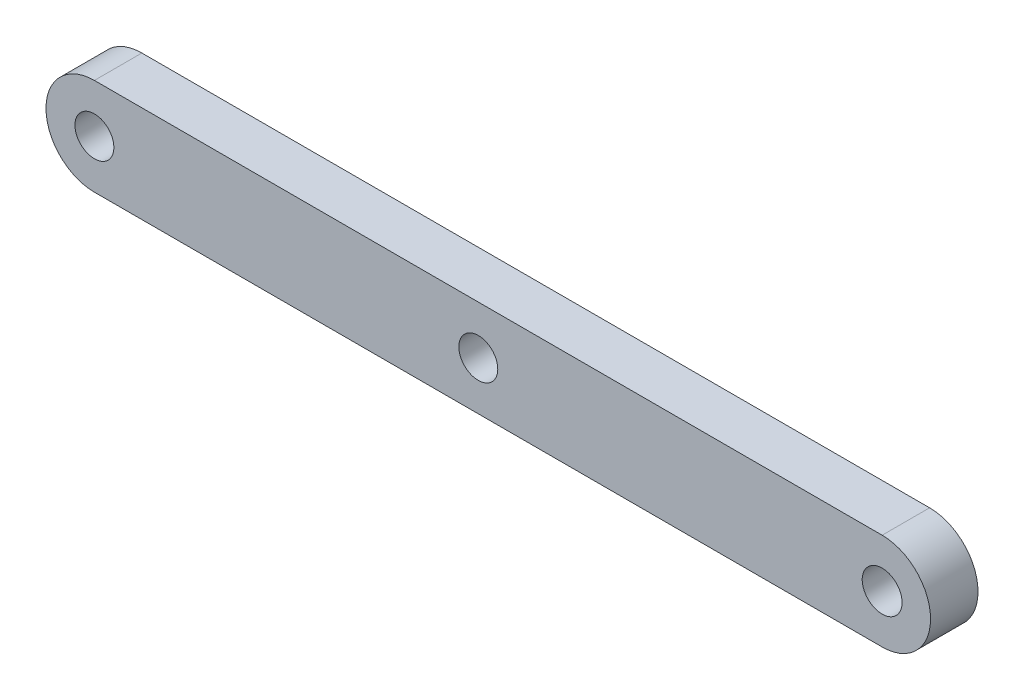
ISO-10303-21;
HEADER;
FILE_DESCRIPTION(('STEP AP214'),'2;1');
FILE_NAME('part.step','',(''),(''),'','','');
FILE_SCHEMA(('AUTOMOTIVE_DESIGN { 1 0 10303 214 1 1 1 1 }'));
ENDSEC;
DATA;
#1=APPLICATION_CONTEXT('core data for automotive mechanical design processes');
#2=APPLICATION_PROTOCOL_DEFINITION('international standard','automotive_design',2000,#1);
#3=PRODUCT_CONTEXT('',#1,'mechanical');
#4=PRODUCT('Part','Part','',(#3));
#5=PRODUCT_RELATED_PRODUCT_CATEGORY('part','',(#4));
#6=PRODUCT_DEFINITION_FORMATION('','',#4);
#7=PRODUCT_DEFINITION_CONTEXT('part definition',#1,'design');
#8=PRODUCT_DEFINITION('design','',#6,#7);
#9=PRODUCT_DEFINITION_SHAPE('','',#8);
#10=(LENGTH_UNIT() NAMED_UNIT(*) SI_UNIT(.MILLI.,.METRE.));
#11=(NAMED_UNIT(*) PLANE_ANGLE_UNIT() SI_UNIT($,.RADIAN.));
#12=(NAMED_UNIT(*) SI_UNIT($,.STERADIAN.) SOLID_ANGLE_UNIT());
#13=UNCERTAINTY_MEASURE_WITH_UNIT(LENGTH_MEASURE(1.E-05),#10,'distance_accuracy_value','');
#14=(GEOMETRIC_REPRESENTATION_CONTEXT(3) GLOBAL_UNCERTAINTY_ASSIGNED_CONTEXT((#13)) GLOBAL_UNIT_ASSIGNED_CONTEXT((#10,
#11,#12)) REPRESENTATION_CONTEXT('',''));
#15=CARTESIAN_POINT('',(0.,0.,0.));
#16=DIRECTION('',(0.,0.,1.));
#17=DIRECTION('',(1.,0.,0.));
#18=AXIS2_PLACEMENT_3D('',#15,#16,#17);
#19=CARTESIAN_POINT('',(0.,0.,5.));
#20=DIRECTION('',(0.,0.,1.));
#21=DIRECTION('',(1.,0.,0.));
#22=AXIS2_PLACEMENT_3D('',#19,#20,#21);
#23=PLANE('',#22);
#24=CARTESIAN_POINT('',(-42.55,0.,5.));
#25=DIRECTION('',(0.,0.,1.));
#26=DIRECTION('',(1.,0.,0.));
#27=AXIS2_PLACEMENT_3D('',#24,#25,#26);
#28=CIRCLE('',#27,2.05);
#29=CARTESIAN_POINT('',(-40.5,0.,5.));
#30=VERTEX_POINT('',#29);
#31=EDGE_CURVE('E116',#30,#30,#28,.T.);
#32=ORIENTED_EDGE('',*,*,#31,.F.);
#33=EDGE_LOOP('',(#32));
#34=FACE_BOUND('',#33,.T.);
#35=CARTESIAN_POINT('',(0.,0.,5.));
#36=DIRECTION('',(0.,0.,1.));
#37=DIRECTION('',(1.,0.,0.));
#38=AXIS2_PLACEMENT_3D('',#35,#36,#37);
#39=CIRCLE('',#38,5.1);
#40=CARTESIAN_POINT('',(0.,-5.1,5.));
#41=VERTEX_POINT('',#40);
#42=CARTESIAN_POINT('',(0.,5.1,5.));
#43=VERTEX_POINT('',#42);
#44=EDGE_CURVE('E86',#41,#43,#39,.T.);
#45=ORIENTED_EDGE('',*,*,#44,.T.);
#46=DIRECTION('',(-1.,0.,0.));
#47=VECTOR('',#46,1.);
#48=CARTESIAN_POINT('',(0.,5.1,5.));
#49=LINE('',#48,#47);
#50=CARTESIAN_POINT('',(-83.,5.09999999999999,5.));
#51=VERTEX_POINT('',#50);
#52=EDGE_CURVE('E81',#43,#51,#49,.T.);
#53=ORIENTED_EDGE('',*,*,#52,.T.);
#54=CARTESIAN_POINT('',(-83.,0.,5.));
#55=DIRECTION('',(0.,0.,1.));
#56=DIRECTION('',(1.,0.,0.));
#57=AXIS2_PLACEMENT_3D('',#54,#55,#56);
#58=CIRCLE('',#57,5.1);
#59=CARTESIAN_POINT('',(-83.,-5.1,5.));
#60=VERTEX_POINT('',#59);
#61=EDGE_CURVE('E84',#51,#60,#58,.T.);
#62=ORIENTED_EDGE('',*,*,#61,.T.);
#63=DIRECTION('',(1.,0.,0.));
#64=VECTOR('',#63,1.);
#65=CARTESIAN_POINT('',(0.,-5.1,5.));
#66=LINE('',#65,#64);
#67=EDGE_CURVE('E51',#60,#41,#66,.T.);
#68=ORIENTED_EDGE('',*,*,#67,.T.);
#69=EDGE_LOOP('',(#45,#53,#62,#68));
#70=FACE_BOUND('',#69,.T.);
#71=CARTESIAN_POINT('',(0.,0.,5.));
#72=DIRECTION('',(0.,0.,1.));
#73=DIRECTION('',(1.,0.,0.));
#74=AXIS2_PLACEMENT_3D('',#71,#72,#73);
#75=CIRCLE('',#74,2.1);
#76=CARTESIAN_POINT('',(2.1,0.,5.));
#77=VERTEX_POINT('',#76);
#78=EDGE_CURVE('E101',#77,#77,#75,.T.);
#79=ORIENTED_EDGE('',*,*,#78,.F.);
#80=EDGE_LOOP('',(#79));
#81=FACE_BOUND('',#80,.T.);
#82=CARTESIAN_POINT('',(-83.,0.,5.));
#83=DIRECTION('',(0.,0.,1.));
#84=DIRECTION('',(1.,0.,0.));
#85=AXIS2_PLACEMENT_3D('',#82,#83,#84);
#86=CIRCLE('',#85,2.04999999999999);
#87=CARTESIAN_POINT('',(-80.95,0.,5.));
#88=VERTEX_POINT('',#87);
#89=EDGE_CURVE('E122',#88,#88,#86,.T.);
#90=ORIENTED_EDGE('',*,*,#89,.F.);
#91=EDGE_LOOP('',(#90));
#92=FACE_BOUND('',#91,.T.);
#93=ADVANCED_FACE('F34',(#34,#70,#81,#92),#23,.T.);
#94=CARTESIAN_POINT('',(0.,0.,0.));
#95=DIRECTION('',(0.,0.,1.));
#96=DIRECTION('',(1.,0.,0.));
#97=AXIS2_PLACEMENT_3D('',#94,#95,#96);
#98=PLANE('',#97);
#99=CARTESIAN_POINT('',(0.,0.,0.));
#100=DIRECTION('',(0.,0.,1.));
#101=DIRECTION('',(1.,0.,0.));
#102=AXIS2_PLACEMENT_3D('',#99,#100,#101);
#103=CIRCLE('',#102,5.1);
#104=CARTESIAN_POINT('',(0.,-5.1,0.));
#105=VERTEX_POINT('',#104);
#106=CARTESIAN_POINT('',(0.,5.1,0.));
#107=VERTEX_POINT('',#106);
#108=EDGE_CURVE('E98',#105,#107,#103,.T.);
#109=ORIENTED_EDGE('',*,*,#108,.F.);
#110=DIRECTION('',(1.,0.,0.));
#111=VECTOR('',#110,1.);
#112=CARTESIAN_POINT('',(0.,-5.1,0.));
#113=LINE('',#112,#111);
#114=CARTESIAN_POINT('',(-83.,-5.1,0.));
#115=VERTEX_POINT('',#114);
#116=EDGE_CURVE('E74',#115,#105,#113,.T.);
#117=ORIENTED_EDGE('',*,*,#116,.F.);
#118=CARTESIAN_POINT('',(-83.,0.,0.));
#119=DIRECTION('',(0.,0.,1.));
#120=DIRECTION('',(1.,0.,0.));
#121=AXIS2_PLACEMENT_3D('',#118,#119,#120);
#122=CIRCLE('',#121,5.1);
#123=CARTESIAN_POINT('',(-83.,5.09999999999999,0.));
#124=VERTEX_POINT('',#123);
#125=EDGE_CURVE('E68',#124,#115,#122,.T.);
#126=ORIENTED_EDGE('',*,*,#125,.F.);
#127=DIRECTION('',(-1.,0.,0.));
#128=VECTOR('',#127,1.);
#129=CARTESIAN_POINT('',(0.,5.1,0.));
#130=LINE('',#129,#128);
#131=EDGE_CURVE('E90',#107,#124,#130,.T.);
#132=ORIENTED_EDGE('',*,*,#131,.F.);
#133=EDGE_LOOP('',(#109,#117,#126,#132));
#134=FACE_BOUND('',#133,.T.);
#135=CARTESIAN_POINT('',(0.,0.,0.));
#136=DIRECTION('',(0.,0.,1.));
#137=DIRECTION('',(1.,0.,0.));
#138=AXIS2_PLACEMENT_3D('',#135,#136,#137);
#139=CIRCLE('',#138,2.1);
#140=CARTESIAN_POINT('',(2.1,0.,0.));
#141=VERTEX_POINT('',#140);
#142=EDGE_CURVE('E113',#141,#141,#139,.T.);
#143=ORIENTED_EDGE('',*,*,#142,.T.);
#144=EDGE_LOOP('',(#143));
#145=FACE_BOUND('',#144,.T.);
#146=CARTESIAN_POINT('',(-42.55,0.,0.));
#147=DIRECTION('',(0.,0.,1.));
#148=DIRECTION('',(1.,0.,0.));
#149=AXIS2_PLACEMENT_3D('',#146,#147,#148);
#150=CIRCLE('',#149,2.05);
#151=CARTESIAN_POINT('',(-40.5,0.,0.));
#152=VERTEX_POINT('',#151);
#153=EDGE_CURVE('E119',#152,#152,#150,.T.);
#154=ORIENTED_EDGE('',*,*,#153,.T.);
#155=EDGE_LOOP('',(#154));
#156=FACE_BOUND('',#155,.T.);
#157=CARTESIAN_POINT('',(-83.,0.,0.));
#158=DIRECTION('',(0.,0.,1.));
#159=DIRECTION('',(1.,0.,0.));
#160=AXIS2_PLACEMENT_3D('',#157,#158,#159);
#161=CIRCLE('',#160,2.04999999999999);
#162=CARTESIAN_POINT('',(-80.95,0.,0.));
#163=VERTEX_POINT('',#162);
#164=EDGE_CURVE('E125',#163,#163,#161,.T.);
#165=ORIENTED_EDGE('',*,*,#164,.T.);
#166=EDGE_LOOP('',(#165));
#167=FACE_BOUND('',#166,.T.);
#168=ADVANCED_FACE('F109',(#134,#145,#156,#167),#98,.F.);
#169=CARTESIAN_POINT('',(0.,0.,5.));
#170=DIRECTION('',(0.,0.,-1.));
#171=DIRECTION('',(-1.,0.,0.));
#172=AXIS2_PLACEMENT_3D('',#169,#170,#171);
#173=CYLINDRICAL_SURFACE('',#172,5.1);
#174=ORIENTED_EDGE('',*,*,#108,.T.);
#175=DIRECTION('',(0.,0.,-1.));
#176=VECTOR('',#175,1.);
#177=CARTESIAN_POINT('',(0.,5.1,5.));
#178=LINE('',#177,#176);
#179=EDGE_CURVE('E11',#43,#107,#178,.T.);
#180=ORIENTED_EDGE('',*,*,#179,.F.);
#181=ORIENTED_EDGE('',*,*,#44,.F.);
#182=DIRECTION('',(0.,0.,-1.));
#183=VECTOR('',#182,1.);
#184=CARTESIAN_POINT('',(0.,-5.1,5.));
#185=LINE('',#184,#183);
#186=EDGE_CURVE('E94',#41,#105,#185,.T.);
#187=ORIENTED_EDGE('',*,*,#186,.T.);
#188=EDGE_LOOP('',(#174,#180,#181,#187));
#189=FACE_BOUND('',#188,.T.);
#190=ADVANCED_FACE('F36',(#189),#173,.T.);
#191=CARTESIAN_POINT('',(0.,5.1,5.));
#192=DIRECTION('',(0.,-1.,0.));
#193=DIRECTION('',(1.,0.,0.));
#194=AXIS2_PLACEMENT_3D('',#191,#192,#193);
#195=PLANE('',#194);
#196=ORIENTED_EDGE('',*,*,#131,.T.);
#197=DIRECTION('',(0.,0.,-1.));
#198=VECTOR('',#197,1.);
#199=CARTESIAN_POINT('',(-83.,5.09999999999999,5.));
#200=LINE('',#199,#198);
#201=EDGE_CURVE('E43',#51,#124,#200,.T.);
#202=ORIENTED_EDGE('',*,*,#201,.F.);
#203=ORIENTED_EDGE('',*,*,#52,.F.);
#204=ORIENTED_EDGE('',*,*,#179,.T.);
#205=EDGE_LOOP('',(#196,#202,#203,#204));
#206=FACE_BOUND('',#205,.T.);
#207=ADVANCED_FACE('F89',(#206),#195,.F.);
#208=CARTESIAN_POINT('',(-83.,0.,5.));
#209=DIRECTION('',(0.,0.,-1.));
#210=DIRECTION('',(-1.,0.,0.));
#211=AXIS2_PLACEMENT_3D('',#208,#209,#210);
#212=CYLINDRICAL_SURFACE('',#211,5.1);
#213=ORIENTED_EDGE('',*,*,#125,.T.);
#214=DIRECTION('',(0.,0.,-1.));
#215=VECTOR('',#214,1.);
#216=CARTESIAN_POINT('',(-83.,-5.1,5.));
#217=LINE('',#216,#215);
#218=EDGE_CURVE('E91',#60,#115,#217,.T.);
#219=ORIENTED_EDGE('',*,*,#218,.F.);
#220=ORIENTED_EDGE('',*,*,#61,.F.);
#221=ORIENTED_EDGE('',*,*,#201,.T.);
#222=EDGE_LOOP('',(#213,#219,#220,#221));
#223=FACE_BOUND('',#222,.T.);
#224=ADVANCED_FACE('F92',(#223),#212,.T.);
#225=CARTESIAN_POINT('',(0.,-5.1,5.));
#226=DIRECTION('',(0.,1.,0.));
#227=DIRECTION('',(-1.,0.,0.));
#228=AXIS2_PLACEMENT_3D('',#225,#226,#227);
#229=PLANE('',#228);
#230=ORIENTED_EDGE('',*,*,#116,.T.);
#231=ORIENTED_EDGE('',*,*,#186,.F.);
#232=ORIENTED_EDGE('',*,*,#67,.F.);
#233=ORIENTED_EDGE('',*,*,#218,.T.);
#234=EDGE_LOOP('',(#230,#231,#232,#233));
#235=FACE_BOUND('',#234,.T.);
#236=ADVANCED_FACE('F106',(#235),#229,.F.);
#237=CARTESIAN_POINT('',(0.,0.,5.));
#238=DIRECTION('',(0.,0.,-1.));
#239=DIRECTION('',(-1.,0.,0.));
#240=AXIS2_PLACEMENT_3D('',#237,#238,#239);
#241=CYLINDRICAL_SURFACE('',#240,2.1);
#242=ORIENTED_EDGE('',*,*,#78,.T.);
#243=EDGE_LOOP('',(#242));
#244=FACE_BOUND('',#243,.T.);
#245=ORIENTED_EDGE('',*,*,#142,.F.);
#246=EDGE_LOOP('',(#245));
#247=FACE_BOUND('',#246,.T.);
#248=ADVANCED_FACE('F143',(#244,#247),#241,.F.);
#249=CARTESIAN_POINT('',(-42.55,0.,5.));
#250=DIRECTION('',(0.,0.,-1.));
#251=DIRECTION('',(-1.,0.,0.));
#252=AXIS2_PLACEMENT_3D('',#249,#250,#251);
#253=CYLINDRICAL_SURFACE('',#252,2.05);
#254=ORIENTED_EDGE('',*,*,#31,.T.);
#255=EDGE_LOOP('',(#254));
#256=FACE_BOUND('',#255,.T.);
#257=ORIENTED_EDGE('',*,*,#153,.F.);
#258=EDGE_LOOP('',(#257));
#259=FACE_BOUND('',#258,.T.);
#260=ADVANCED_FACE('F189',(#256,#259),#253,.F.);
#261=CARTESIAN_POINT('',(-83.,0.,5.));
#262=DIRECTION('',(0.,0.,-1.));
#263=DIRECTION('',(-1.,0.,0.));
#264=AXIS2_PLACEMENT_3D('',#261,#262,#263);
#265=CYLINDRICAL_SURFACE('',#264,2.04999999999999);
#266=ORIENTED_EDGE('',*,*,#89,.T.);
#267=EDGE_LOOP('',(#266));
#268=FACE_BOUND('',#267,.T.);
#269=ORIENTED_EDGE('',*,*,#164,.F.);
#270=EDGE_LOOP('',(#269));
#271=FACE_BOUND('',#270,.T.);
#272=ADVANCED_FACE('F131',(#268,#271),#265,.F.);
#273=CLOSED_SHELL('',(#93,#168,#190,#207,#224,#236,#248,#260,#272));
#274=MANIFOLD_SOLID_BREP('B2',#273);
#275=ADVANCED_BREP_SHAPE_REPRESENTATION('',(#18,#274),#14);
#276=SHAPE_DEFINITION_REPRESENTATION(#9,#275);
ENDSEC;
END-ISO-10303-21;
